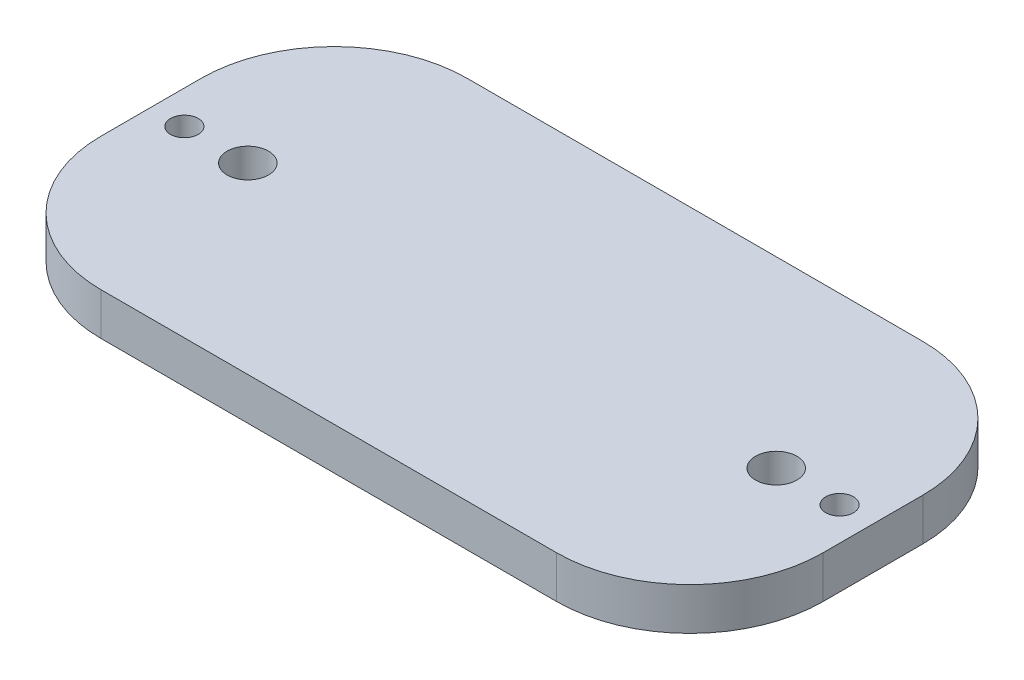
ISO-10303-21;
HEADER;
FILE_DESCRIPTION(('STEP AP214'),'2;1');
FILE_NAME('part.step','',(''),(''),'','','');
FILE_SCHEMA(('AUTOMOTIVE_DESIGN { 1 0 10303 214 1 1 1 1 }'));
ENDSEC;
DATA;
#1=APPLICATION_CONTEXT('core data for automotive mechanical design processes');
#2=APPLICATION_PROTOCOL_DEFINITION('international standard','automotive_design',2000,#1);
#3=PRODUCT_CONTEXT('',#1,'mechanical');
#4=PRODUCT('Part','Part','',(#3));
#5=PRODUCT_RELATED_PRODUCT_CATEGORY('part','',(#4));
#6=PRODUCT_DEFINITION_FORMATION('','',#4);
#7=PRODUCT_DEFINITION_CONTEXT('part definition',#1,'design');
#8=PRODUCT_DEFINITION('design','',#6,#7);
#9=PRODUCT_DEFINITION_SHAPE('','',#8);
#10=(LENGTH_UNIT() NAMED_UNIT(*) SI_UNIT(.MILLI.,.METRE.));
#11=(NAMED_UNIT(*) PLANE_ANGLE_UNIT() SI_UNIT($,.RADIAN.));
#12=(NAMED_UNIT(*) SI_UNIT($,.STERADIAN.) SOLID_ANGLE_UNIT());
#13=UNCERTAINTY_MEASURE_WITH_UNIT(LENGTH_MEASURE(1.E-05),#10,'distance_accuracy_value','');
#14=(GEOMETRIC_REPRESENTATION_CONTEXT(3) GLOBAL_UNCERTAINTY_ASSIGNED_CONTEXT((#13)) GLOBAL_UNIT_ASSIGNED_CONTEXT((#10,
#11,#12)) REPRESENTATION_CONTEXT('',''));
#15=CARTESIAN_POINT('',(0.,0.,0.));
#16=DIRECTION('',(0.,0.,1.));
#17=DIRECTION('',(1.,0.,0.));
#18=AXIS2_PLACEMENT_3D('',#15,#16,#17);
#19=CARTESIAN_POINT('',(-34.2125,6.35,-7.5));
#20=DIRECTION('',(0.,-1.,0.));
#21=DIRECTION('',(0.,0.,-1.));
#22=AXIS2_PLACEMENT_3D('',#19,#20,#21);
#23=PLANE('',#22);
#24=CARTESIAN_POINT('',(-39.6875,6.35,0.));
#25=DIRECTION('',(0.,1.,0.));
#26=DIRECTION('',(0.,0.,1.));
#27=AXIS2_PLACEMENT_3D('',#24,#25,#26);
#28=CIRCLE('',#27,3.11);
#29=CARTESIAN_POINT('',(-39.6875,6.35,3.11));
#30=VERTEX_POINT('',#29);
#31=EDGE_CURVE('E188',#30,#30,#28,.T.);
#32=ORIENTED_EDGE('',*,*,#31,.F.);
#33=EDGE_LOOP('',(#32));
#34=FACE_BOUND('',#33,.T.);
#35=CARTESIAN_POINT('',(-49.2125,6.35,0.));
#36=DIRECTION('',(0.,1.,0.));
#37=DIRECTION('',(0.,0.,1.));
#38=AXIS2_PLACEMENT_3D('',#35,#36,#37);
#39=CIRCLE('',#38,2.0828);
#40=CARTESIAN_POINT('',(-49.2125,6.35,2.0828));
#41=VERTEX_POINT('',#40);
#42=EDGE_CURVE('E134',#41,#41,#39,.T.);
#43=ORIENTED_EDGE('',*,*,#42,.F.);
#44=EDGE_LOOP('',(#43));
#45=FACE_BOUND('',#44,.T.);
#46=CARTESIAN_POINT('',(-34.2125,6.35,-7.5));
#47=DIRECTION('',(0.,1.,0.));
#48=DIRECTION('',(0.,0.,-1.));
#49=AXIS2_PLACEMENT_3D('',#46,#47,#48);
#50=CIRCLE('',#49,20.);
#51=CARTESIAN_POINT('',(-34.2124999999999,6.35,-27.5));
#52=VERTEX_POINT('',#51);
#53=CARTESIAN_POINT('',(-54.2125,6.35,-7.49999999999985));
#54=VERTEX_POINT('',#53);
#55=EDGE_CURVE('E145',#52,#54,#50,.T.);
#56=ORIENTED_EDGE('',*,*,#55,.T.);
#57=DIRECTION('',(0.,0.,1.));
#58=VECTOR('',#57,1.);
#59=CARTESIAN_POINT('',(-54.2125,6.35,7.49999999999985));
#60=LINE('',#59,#58);
#61=CARTESIAN_POINT('',(-54.2125,6.35,7.49999999999985));
#62=VERTEX_POINT('',#61);
#63=EDGE_CURVE('E93',#54,#62,#60,.T.);
#64=ORIENTED_EDGE('',*,*,#63,.T.);
#65=CARTESIAN_POINT('',(-34.2125,6.35,7.5));
#66=DIRECTION('',(0.,1.,0.));
#67=DIRECTION('',(0.,0.,-1.));
#68=AXIS2_PLACEMENT_3D('',#65,#66,#67);
#69=CIRCLE('',#68,20.);
#70=CARTESIAN_POINT('',(-34.2124999999999,6.35,27.5));
#71=VERTEX_POINT('',#70);
#72=EDGE_CURVE('E160',#62,#71,#69,.T.);
#73=ORIENTED_EDGE('',*,*,#72,.T.);
#74=DIRECTION('',(1.,0.,0.));
#75=VECTOR('',#74,1.);
#76=CARTESIAN_POINT('',(-34.2124999999999,6.35,27.5));
#77=LINE('',#76,#75);
#78=CARTESIAN_POINT('',(34.2124999999999,6.35,27.5));
#79=VERTEX_POINT('',#78);
#80=EDGE_CURVE('E173',#71,#79,#77,.T.);
#81=ORIENTED_EDGE('',*,*,#80,.T.);
#82=CARTESIAN_POINT('',(34.2125,6.35,7.5));
#83=DIRECTION('',(0.,1.,0.));
#84=DIRECTION('',(0.,0.,-1.));
#85=AXIS2_PLACEMENT_3D('',#82,#83,#84);
#86=CIRCLE('',#85,20.);
#87=CARTESIAN_POINT('',(54.2125,6.35,7.49999999999985));
#88=VERTEX_POINT('',#87);
#89=EDGE_CURVE('E112',#79,#88,#86,.T.);
#90=ORIENTED_EDGE('',*,*,#89,.T.);
#91=DIRECTION('',(0.,0.,-1.));
#92=VECTOR('',#91,1.);
#93=CARTESIAN_POINT('',(54.2125,6.35,7.49999999999985));
#94=LINE('',#93,#92);
#95=CARTESIAN_POINT('',(54.2125,6.35,-7.49999999999985));
#96=VERTEX_POINT('',#95);
#97=EDGE_CURVE('E106',#88,#96,#94,.T.);
#98=ORIENTED_EDGE('',*,*,#97,.T.);
#99=CARTESIAN_POINT('',(34.2125,6.35,-7.5));
#100=DIRECTION('',(0.,1.,0.));
#101=DIRECTION('',(0.,0.,-1.));
#102=AXIS2_PLACEMENT_3D('',#99,#100,#101);
#103=CIRCLE('',#102,20.);
#104=CARTESIAN_POINT('',(34.2124999999999,6.35,-27.5));
#105=VERTEX_POINT('',#104);
#106=EDGE_CURVE('E110',#96,#105,#103,.T.);
#107=ORIENTED_EDGE('',*,*,#106,.T.);
#108=DIRECTION('',(-1.,0.,0.));
#109=VECTOR('',#108,1.);
#110=CARTESIAN_POINT('',(-34.2124999999999,6.35,-27.5));
#111=LINE('',#110,#109);
#112=EDGE_CURVE('E50',#105,#52,#111,.T.);
#113=ORIENTED_EDGE('',*,*,#112,.T.);
#114=EDGE_LOOP('',(#56,#64,#73,#81,#90,#98,#107,#113));
#115=FACE_BOUND('',#114,.T.);
#116=CARTESIAN_POINT('',(49.2125,6.35,0.));
#117=DIRECTION('',(0.,1.,0.));
#118=DIRECTION('',(0.,0.,1.));
#119=AXIS2_PLACEMENT_3D('',#116,#117,#118);
#120=CIRCLE('',#119,2.0828);
#121=CARTESIAN_POINT('',(49.2125,6.35,2.0828));
#122=VERTEX_POINT('',#121);
#123=EDGE_CURVE('E182',#122,#122,#120,.T.);
#124=ORIENTED_EDGE('',*,*,#123,.F.);
#125=EDGE_LOOP('',(#124));
#126=FACE_BOUND('',#125,.T.);
#127=CARTESIAN_POINT('',(39.6875,6.35,0.));
#128=DIRECTION('',(0.,1.,0.));
#129=DIRECTION('',(0.,0.,1.));
#130=AXIS2_PLACEMENT_3D('',#127,#128,#129);
#131=CIRCLE('',#130,3.11);
#132=CARTESIAN_POINT('',(39.6875,6.35,3.11));
#133=VERTEX_POINT('',#132);
#134=EDGE_CURVE('E194',#133,#133,#131,.T.);
#135=ORIENTED_EDGE('',*,*,#134,.F.);
#136=EDGE_LOOP('',(#135));
#137=FACE_BOUND('',#136,.T.);
#138=ADVANCED_FACE('F33',(#34,#45,#115,#126,#137),#23,.F.);
#139=CARTESIAN_POINT('',(-34.2125,0.,-7.5));
#140=DIRECTION('',(0.,-1.,0.));
#141=DIRECTION('',(0.,0.,-1.));
#142=AXIS2_PLACEMENT_3D('',#139,#140,#141);
#143=PLANE('',#142);
#144=CARTESIAN_POINT('',(-39.6875,0.,0.));
#145=DIRECTION('',(0.,1.,0.));
#146=DIRECTION('',(0.,0.,1.));
#147=AXIS2_PLACEMENT_3D('',#144,#145,#146);
#148=CIRCLE('',#147,3.11);
#149=CARTESIAN_POINT('',(-39.6875,0.,3.11));
#150=VERTEX_POINT('',#149);
#151=EDGE_CURVE('E191',#150,#150,#148,.T.);
#152=ORIENTED_EDGE('',*,*,#151,.T.);
#153=EDGE_LOOP('',(#152));
#154=FACE_BOUND('',#153,.T.);
#155=CARTESIAN_POINT('',(-49.2125,0.,0.));
#156=DIRECTION('',(0.,1.,0.));
#157=DIRECTION('',(0.,0.,1.));
#158=AXIS2_PLACEMENT_3D('',#155,#156,#157);
#159=CIRCLE('',#158,2.0828);
#160=CARTESIAN_POINT('',(-49.2125,0.,2.0828));
#161=VERTEX_POINT('',#160);
#162=EDGE_CURVE('E179',#161,#161,#159,.T.);
#163=ORIENTED_EDGE('',*,*,#162,.T.);
#164=EDGE_LOOP('',(#163));
#165=FACE_BOUND('',#164,.T.);
#166=CARTESIAN_POINT('',(-34.2125,0.,-7.5));
#167=DIRECTION('',(0.,1.,0.));
#168=DIRECTION('',(0.,0.,-1.));
#169=AXIS2_PLACEMENT_3D('',#166,#167,#168);
#170=CIRCLE('',#169,20.);
#171=CARTESIAN_POINT('',(-34.2124999999999,0.,-27.5));
#172=VERTEX_POINT('',#171);
#173=CARTESIAN_POINT('',(-54.2125,0.,-7.49999999999985));
#174=VERTEX_POINT('',#173);
#175=EDGE_CURVE('E130',#172,#174,#170,.T.);
#176=ORIENTED_EDGE('',*,*,#175,.F.);
#177=DIRECTION('',(-1.,0.,0.));
#178=VECTOR('',#177,1.);
#179=CARTESIAN_POINT('',(-34.2124999999999,0.,-27.5));
#180=LINE('',#179,#178);
#181=CARTESIAN_POINT('',(34.2124999999999,0.,-27.5));
#182=VERTEX_POINT('',#181);
#183=EDGE_CURVE('E85',#182,#172,#180,.T.);
#184=ORIENTED_EDGE('',*,*,#183,.F.);
#185=CARTESIAN_POINT('',(34.2125,0.,-7.5));
#186=DIRECTION('',(0.,1.,0.));
#187=DIRECTION('',(0.,0.,-1.));
#188=AXIS2_PLACEMENT_3D('',#185,#186,#187);
#189=CIRCLE('',#188,20.);
#190=CARTESIAN_POINT('',(54.2125,0.,-7.49999999999985));
#191=VERTEX_POINT('',#190);
#192=EDGE_CURVE('E79',#191,#182,#189,.T.);
#193=ORIENTED_EDGE('',*,*,#192,.F.);
#194=DIRECTION('',(0.,0.,-1.));
#195=VECTOR('',#194,1.);
#196=CARTESIAN_POINT('',(54.2125,0.,7.49999999999985));
#197=LINE('',#196,#195);
#198=CARTESIAN_POINT('',(54.2125,0.,7.49999999999985));
#199=VERTEX_POINT('',#198);
#200=EDGE_CURVE('E120',#199,#191,#197,.T.);
#201=ORIENTED_EDGE('',*,*,#200,.F.);
#202=CARTESIAN_POINT('',(34.2125,0.,7.5));
#203=DIRECTION('',(0.,1.,0.));
#204=DIRECTION('',(0.,0.,-1.));
#205=AXIS2_PLACEMENT_3D('',#202,#203,#204);
#206=CIRCLE('',#205,20.);
#207=CARTESIAN_POINT('',(34.2124999999999,0.,27.5));
#208=VERTEX_POINT('',#207);
#209=EDGE_CURVE('E140',#208,#199,#206,.T.);
#210=ORIENTED_EDGE('',*,*,#209,.F.);
#211=DIRECTION('',(1.,0.,0.));
#212=VECTOR('',#211,1.);
#213=CARTESIAN_POINT('',(-34.2124999999999,0.,27.5));
#214=LINE('',#213,#212);
#215=CARTESIAN_POINT('',(-34.2124999999999,0.,27.5));
#216=VERTEX_POINT('',#215);
#217=EDGE_CURVE('E138',#216,#208,#214,.T.);
#218=ORIENTED_EDGE('',*,*,#217,.F.);
#219=CARTESIAN_POINT('',(-34.2125,0.,7.5));
#220=DIRECTION('',(0.,1.,0.));
#221=DIRECTION('',(0.,0.,-1.));
#222=AXIS2_PLACEMENT_3D('',#219,#220,#221);
#223=CIRCLE('',#222,20.);
#224=CARTESIAN_POINT('',(-54.2125,0.,7.49999999999985));
#225=VERTEX_POINT('',#224);
#226=EDGE_CURVE('E136',#225,#216,#223,.T.);
#227=ORIENTED_EDGE('',*,*,#226,.F.);
#228=DIRECTION('',(0.,0.,1.));
#229=VECTOR('',#228,1.);
#230=CARTESIAN_POINT('',(-54.2125,0.,7.49999999999985));
#231=LINE('',#230,#229);
#232=EDGE_CURVE('E133',#174,#225,#231,.T.);
#233=ORIENTED_EDGE('',*,*,#232,.F.);
#234=EDGE_LOOP('',(#176,#184,#193,#201,#210,#218,#227,#233));
#235=FACE_BOUND('',#234,.T.);
#236=CARTESIAN_POINT('',(49.2125,0.,0.));
#237=DIRECTION('',(0.,1.,0.));
#238=DIRECTION('',(0.,0.,1.));
#239=AXIS2_PLACEMENT_3D('',#236,#237,#238);
#240=CIRCLE('',#239,2.0828);
#241=CARTESIAN_POINT('',(49.2125,0.,2.0828));
#242=VERTEX_POINT('',#241);
#243=EDGE_CURVE('E185',#242,#242,#240,.T.);
#244=ORIENTED_EDGE('',*,*,#243,.T.);
#245=EDGE_LOOP('',(#244));
#246=FACE_BOUND('',#245,.T.);
#247=CARTESIAN_POINT('',(39.6875,0.,0.));
#248=DIRECTION('',(0.,1.,0.));
#249=DIRECTION('',(0.,0.,1.));
#250=AXIS2_PLACEMENT_3D('',#247,#248,#249);
#251=CIRCLE('',#250,3.11);
#252=CARTESIAN_POINT('',(39.6875,0.,3.11));
#253=VERTEX_POINT('',#252);
#254=EDGE_CURVE('E197',#253,#253,#251,.T.);
#255=ORIENTED_EDGE('',*,*,#254,.T.);
#256=EDGE_LOOP('',(#255));
#257=FACE_BOUND('',#256,.T.);
#258=ADVANCED_FACE('F164',(#154,#165,#235,#246,#257),#143,.T.);
#259=CARTESIAN_POINT('',(-34.2125,6.35,-7.5));
#260=DIRECTION('',(0.,-1.,0.));
#261=DIRECTION('',(0.,0.,-1.));
#262=AXIS2_PLACEMENT_3D('',#259,#260,#261);
#263=CYLINDRICAL_SURFACE('',#262,20.);
#264=ORIENTED_EDGE('',*,*,#175,.T.);
#265=DIRECTION('',(0.,-1.,0.));
#266=VECTOR('',#265,1.);
#267=CARTESIAN_POINT('',(-54.2125,6.35,-7.49999999999985));
#268=LINE('',#267,#266);
#269=EDGE_CURVE('E11',#54,#174,#268,.T.);
#270=ORIENTED_EDGE('',*,*,#269,.F.);
#271=ORIENTED_EDGE('',*,*,#55,.F.);
#272=DIRECTION('',(0.,-1.,0.));
#273=VECTOR('',#272,1.);
#274=CARTESIAN_POINT('',(-34.2124999999999,6.35,-27.5));
#275=LINE('',#274,#273);
#276=EDGE_CURVE('E126',#52,#172,#275,.T.);
#277=ORIENTED_EDGE('',*,*,#276,.T.);
#278=EDGE_LOOP('',(#264,#270,#271,#277));
#279=FACE_BOUND('',#278,.T.);
#280=ADVANCED_FACE('F35',(#279),#263,.T.);
#281=CARTESIAN_POINT('',(-54.2125,6.35,7.49999999999985));
#282=DIRECTION('',(1.,0.,0.));
#283=DIRECTION('',(0.,0.,-1.));
#284=AXIS2_PLACEMENT_3D('',#281,#282,#283);
#285=PLANE('',#284);
#286=ORIENTED_EDGE('',*,*,#232,.T.);
#287=DIRECTION('',(0.,-1.,0.));
#288=VECTOR('',#287,1.);
#289=CARTESIAN_POINT('',(-54.2125,6.35,7.49999999999985));
#290=LINE('',#289,#288);
#291=EDGE_CURVE('E42',#62,#225,#290,.T.);
#292=ORIENTED_EDGE('',*,*,#291,.F.);
#293=ORIENTED_EDGE('',*,*,#63,.F.);
#294=ORIENTED_EDGE('',*,*,#269,.T.);
#295=EDGE_LOOP('',(#286,#292,#293,#294));
#296=FACE_BOUND('',#295,.T.);
#297=ADVANCED_FACE('F232',(#296),#285,.F.);
#298=CARTESIAN_POINT('',(-34.2125,6.35,7.5));
#299=DIRECTION('',(0.,-1.,0.));
#300=DIRECTION('',(0.,0.,-1.));
#301=AXIS2_PLACEMENT_3D('',#298,#299,#300);
#302=CYLINDRICAL_SURFACE('',#301,20.);
#303=ORIENTED_EDGE('',*,*,#226,.T.);
#304=DIRECTION('',(0.,-1.,0.));
#305=VECTOR('',#304,1.);
#306=CARTESIAN_POINT('',(-34.2124999999999,6.35,27.5));
#307=LINE('',#306,#305);
#308=EDGE_CURVE('E152',#71,#216,#307,.T.);
#309=ORIENTED_EDGE('',*,*,#308,.F.);
#310=ORIENTED_EDGE('',*,*,#72,.F.);
#311=ORIENTED_EDGE('',*,*,#291,.T.);
#312=EDGE_LOOP('',(#303,#309,#310,#311));
#313=FACE_BOUND('',#312,.T.);
#314=ADVANCED_FACE('F158',(#313),#302,.T.);
#315=CARTESIAN_POINT('',(-34.2124999999999,6.35,27.5));
#316=DIRECTION('',(0.,0.,-1.));
#317=DIRECTION('',(-1.,0.,0.));
#318=AXIS2_PLACEMENT_3D('',#315,#316,#317);
#319=PLANE('',#318);
#320=ORIENTED_EDGE('',*,*,#217,.T.);
#321=DIRECTION('',(0.,-1.,0.));
#322=VECTOR('',#321,1.);
#323=CARTESIAN_POINT('',(34.2124999999999,6.35,27.5));
#324=LINE('',#323,#322);
#325=EDGE_CURVE('E149',#79,#208,#324,.T.);
#326=ORIENTED_EDGE('',*,*,#325,.F.);
#327=ORIENTED_EDGE('',*,*,#80,.F.);
#328=ORIENTED_EDGE('',*,*,#308,.T.);
#329=EDGE_LOOP('',(#320,#326,#327,#328));
#330=FACE_BOUND('',#329,.T.);
#331=ADVANCED_FACE('F169',(#330),#319,.F.);
#332=CARTESIAN_POINT('',(34.2125,6.35,7.5));
#333=DIRECTION('',(0.,-1.,0.));
#334=DIRECTION('',(0.,0.,-1.));
#335=AXIS2_PLACEMENT_3D('',#332,#333,#334);
#336=CYLINDRICAL_SURFACE('',#335,20.);
#337=ORIENTED_EDGE('',*,*,#209,.T.);
#338=DIRECTION('',(0.,-1.,0.));
#339=VECTOR('',#338,1.);
#340=CARTESIAN_POINT('',(54.2125,6.35,7.49999999999985));
#341=LINE('',#340,#339);
#342=EDGE_CURVE('E121',#88,#199,#341,.T.);
#343=ORIENTED_EDGE('',*,*,#342,.F.);
#344=ORIENTED_EDGE('',*,*,#89,.F.);
#345=ORIENTED_EDGE('',*,*,#325,.T.);
#346=EDGE_LOOP('',(#337,#343,#344,#345));
#347=FACE_BOUND('',#346,.T.);
#348=ADVANCED_FACE('F172',(#347),#336,.T.);
#349=CARTESIAN_POINT('',(54.2125,6.35,7.49999999999985));
#350=DIRECTION('',(-1.,0.,0.));
#351=DIRECTION('',(0.,0.,1.));
#352=AXIS2_PLACEMENT_3D('',#349,#350,#351);
#353=PLANE('',#352);
#354=ORIENTED_EDGE('',*,*,#200,.T.);
#355=DIRECTION('',(0.,-1.,0.));
#356=VECTOR('',#355,1.);
#357=CARTESIAN_POINT('',(54.2125,6.35,-7.49999999999985));
#358=LINE('',#357,#356);
#359=EDGE_CURVE('E117',#96,#191,#358,.T.);
#360=ORIENTED_EDGE('',*,*,#359,.F.);
#361=ORIENTED_EDGE('',*,*,#97,.F.);
#362=ORIENTED_EDGE('',*,*,#342,.T.);
#363=EDGE_LOOP('',(#354,#360,#361,#362));
#364=FACE_BOUND('',#363,.T.);
#365=ADVANCED_FACE('F118',(#364),#353,.F.);
#366=CARTESIAN_POINT('',(34.2125,6.35,-7.5));
#367=DIRECTION('',(0.,-1.,0.));
#368=DIRECTION('',(0.,0.,-1.));
#369=AXIS2_PLACEMENT_3D('',#366,#367,#368);
#370=CYLINDRICAL_SURFACE('',#369,20.);
#371=ORIENTED_EDGE('',*,*,#192,.T.);
#372=DIRECTION('',(0.,-1.,0.));
#373=VECTOR('',#372,1.);
#374=CARTESIAN_POINT('',(34.2124999999999,6.35,-27.5));
#375=LINE('',#374,#373);
#376=EDGE_CURVE('E122',#105,#182,#375,.T.);
#377=ORIENTED_EDGE('',*,*,#376,.F.);
#378=ORIENTED_EDGE('',*,*,#106,.F.);
#379=ORIENTED_EDGE('',*,*,#359,.T.);
#380=EDGE_LOOP('',(#371,#377,#378,#379));
#381=FACE_BOUND('',#380,.T.);
#382=ADVANCED_FACE('F124',(#381),#370,.T.);
#383=CARTESIAN_POINT('',(-34.2124999999999,6.35,-27.5));
#384=DIRECTION('',(0.,0.,1.));
#385=DIRECTION('',(1.,0.,0.));
#386=AXIS2_PLACEMENT_3D('',#383,#384,#385);
#387=PLANE('',#386);
#388=ORIENTED_EDGE('',*,*,#183,.T.);
#389=ORIENTED_EDGE('',*,*,#276,.F.);
#390=ORIENTED_EDGE('',*,*,#112,.F.);
#391=ORIENTED_EDGE('',*,*,#376,.T.);
#392=EDGE_LOOP('',(#388,#389,#390,#391));
#393=FACE_BOUND('',#392,.T.);
#394=ADVANCED_FACE('F220',(#393),#387,.F.);
#395=CARTESIAN_POINT('',(-49.2125,6.35,0.));
#396=DIRECTION('',(0.,-1.,0.));
#397=DIRECTION('',(0.,0.,-1.));
#398=AXIS2_PLACEMENT_3D('',#395,#396,#397);
#399=CYLINDRICAL_SURFACE('',#398,2.0828);
#400=ORIENTED_EDGE('',*,*,#42,.T.);
#401=EDGE_LOOP('',(#400));
#402=FACE_BOUND('',#401,.T.);
#403=ORIENTED_EDGE('',*,*,#162,.F.);
#404=EDGE_LOOP('',(#403));
#405=FACE_BOUND('',#404,.T.);
#406=ADVANCED_FACE('F217',(#402,#405),#399,.F.);
#407=CARTESIAN_POINT('',(49.2125,6.35,0.));
#408=DIRECTION('',(0.,-1.,0.));
#409=DIRECTION('',(0.,0.,-1.));
#410=AXIS2_PLACEMENT_3D('',#407,#408,#409);
#411=CYLINDRICAL_SURFACE('',#410,2.0828);
#412=ORIENTED_EDGE('',*,*,#123,.T.);
#413=EDGE_LOOP('',(#412));
#414=FACE_BOUND('',#413,.T.);
#415=ORIENTED_EDGE('',*,*,#243,.F.);
#416=EDGE_LOOP('',(#415));
#417=FACE_BOUND('',#416,.T.);
#418=ADVANCED_FACE('F296',(#414,#417),#411,.F.);
#419=CARTESIAN_POINT('',(-39.6875,6.35,0.));
#420=DIRECTION('',(0.,-1.,0.));
#421=DIRECTION('',(0.,0.,-1.));
#422=AXIS2_PLACEMENT_3D('',#419,#420,#421);
#423=CYLINDRICAL_SURFACE('',#422,3.11);
#424=ORIENTED_EDGE('',*,*,#31,.T.);
#425=EDGE_LOOP('',(#424));
#426=FACE_BOUND('',#425,.T.);
#427=ORIENTED_EDGE('',*,*,#151,.F.);
#428=EDGE_LOOP('',(#427));
#429=FACE_BOUND('',#428,.T.);
#430=ADVANCED_FACE('F304',(#426,#429),#423,.F.);
#431=CARTESIAN_POINT('',(39.6875,6.35,0.));
#432=DIRECTION('',(0.,-1.,0.));
#433=DIRECTION('',(0.,0.,-1.));
#434=AXIS2_PLACEMENT_3D('',#431,#432,#433);
#435=CYLINDRICAL_SURFACE('',#434,3.11);
#436=ORIENTED_EDGE('',*,*,#134,.T.);
#437=EDGE_LOOP('',(#436));
#438=FACE_BOUND('',#437,.T.);
#439=ORIENTED_EDGE('',*,*,#254,.F.);
#440=EDGE_LOOP('',(#439));
#441=FACE_BOUND('',#440,.T.);
#442=ADVANCED_FACE('F203',(#438,#441),#435,.F.);
#443=CLOSED_SHELL('',(#138,#258,#280,#297,#314,#331,#348,#365,#382,#394,#406,#418,#430,#442));
#444=MANIFOLD_SOLID_BREP('B2',#443);
#445=ADVANCED_BREP_SHAPE_REPRESENTATION('',(#18,#444),#14);
#446=SHAPE_DEFINITION_REPRESENTATION(#9,#445);
ENDSEC;
END-ISO-10303-21;
